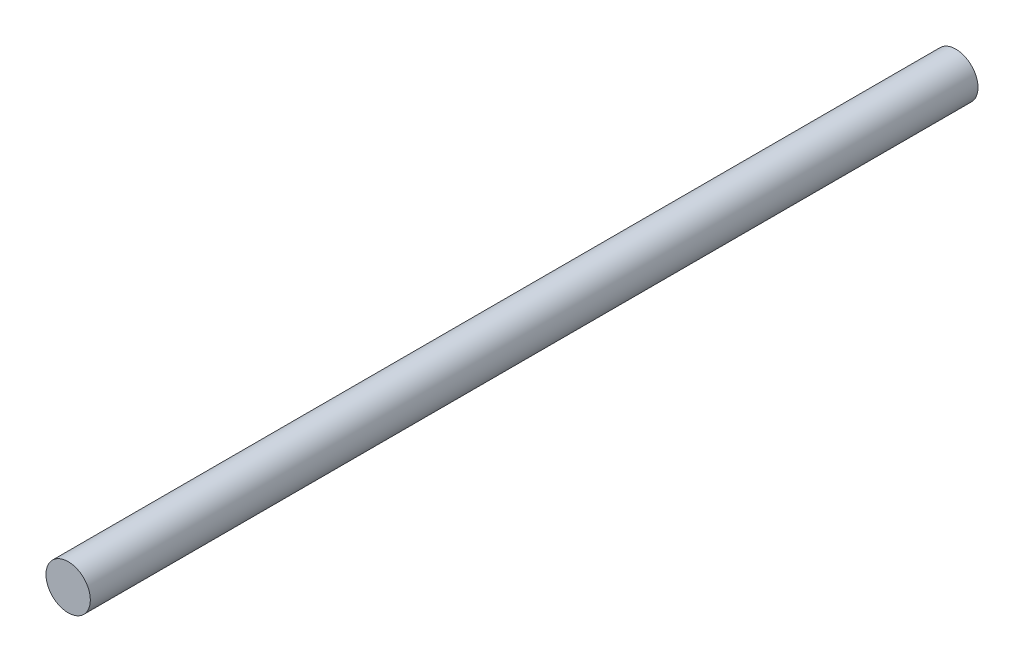
ISO-10303-21;
HEADER;
FILE_DESCRIPTION(('STEP AP214'),'2;1');
FILE_NAME('part.step','',(''),(''),'','','');
FILE_SCHEMA(('AUTOMOTIVE_DESIGN { 1 0 10303 214 1 1 1 1 }'));
ENDSEC;
DATA;
#1=APPLICATION_CONTEXT('core data for automotive mechanical design processes');
#2=APPLICATION_PROTOCOL_DEFINITION('international standard','automotive_design',2000,#1);
#3=PRODUCT_CONTEXT('',#1,'mechanical');
#4=PRODUCT('Part','Part','',(#3));
#5=PRODUCT_RELATED_PRODUCT_CATEGORY('part','',(#4));
#6=PRODUCT_DEFINITION_FORMATION('','',#4);
#7=PRODUCT_DEFINITION_CONTEXT('part definition',#1,'design');
#8=PRODUCT_DEFINITION('design','',#6,#7);
#9=PRODUCT_DEFINITION_SHAPE('','',#8);
#10=(LENGTH_UNIT() NAMED_UNIT(*) SI_UNIT(.MILLI.,.METRE.));
#11=(NAMED_UNIT(*) PLANE_ANGLE_UNIT() SI_UNIT($,.RADIAN.));
#12=(NAMED_UNIT(*) SI_UNIT($,.STERADIAN.) SOLID_ANGLE_UNIT());
#13=UNCERTAINTY_MEASURE_WITH_UNIT(LENGTH_MEASURE(1.E-05),#10,'distance_accuracy_value','');
#14=(GEOMETRIC_REPRESENTATION_CONTEXT(3) GLOBAL_UNCERTAINTY_ASSIGNED_CONTEXT((#13)) GLOBAL_UNIT_ASSIGNED_CONTEXT((#10,
#11,#12)) REPRESENTATION_CONTEXT('',''));
#15=CARTESIAN_POINT('',(0.,0.,0.));
#16=DIRECTION('',(0.,0.,1.));
#17=DIRECTION('',(1.,0.,0.));
#18=AXIS2_PLACEMENT_3D('',#15,#16,#17);
#19=CARTESIAN_POINT('',(0.,0.,47.));
#20=DIRECTION('',(0.,0.,-1.));
#21=DIRECTION('',(-1.,0.,0.));
#22=AXIS2_PLACEMENT_3D('',#19,#20,#21);
#23=CYLINDRICAL_SURFACE('',#22,2.);
#24=CARTESIAN_POINT('',(0.,0.,47.));
#25=DIRECTION('',(0.,0.,1.));
#26=DIRECTION('',(1.,0.,0.));
#27=AXIS2_PLACEMENT_3D('',#24,#25,#26);
#28=CIRCLE('',#27,2.);
#29=CARTESIAN_POINT('',(2.,0.,47.));
#30=VERTEX_POINT('',#29);
#31=EDGE_CURVE('E10',#30,#30,#28,.T.);
#32=ORIENTED_EDGE('',*,*,#31,.F.);
#33=EDGE_LOOP('',(#32));
#34=FACE_BOUND('',#33,.T.);
#35=CARTESIAN_POINT('',(0.,0.,-33.));
#36=DIRECTION('',(0.,0.,1.));
#37=DIRECTION('',(1.,0.,0.));
#38=AXIS2_PLACEMENT_3D('',#35,#36,#37);
#39=CIRCLE('',#38,2.);
#40=CARTESIAN_POINT('',(2.,0.,-33.));
#41=VERTEX_POINT('',#40);
#42=EDGE_CURVE('E39',#41,#41,#39,.T.);
#43=ORIENTED_EDGE('',*,*,#42,.T.);
#44=EDGE_LOOP('',(#43));
#45=FACE_BOUND('',#44,.T.);
#46=ADVANCED_FACE('F36',(#34,#45),#23,.T.);
#47=CARTESIAN_POINT('',(0.,0.,47.));
#48=DIRECTION('',(0.,0.,1.));
#49=DIRECTION('',(1.,0.,0.));
#50=AXIS2_PLACEMENT_3D('',#47,#48,#49);
#51=PLANE('',#50);
#52=ORIENTED_EDGE('',*,*,#31,.T.);
#53=EDGE_LOOP('',(#52));
#54=FACE_BOUND('',#53,.T.);
#55=ADVANCED_FACE('F53',(#54),#51,.T.);
#56=CARTESIAN_POINT('',(0.,0.,-33.));
#57=DIRECTION('',(0.,0.,1.));
#58=DIRECTION('',(1.,0.,0.));
#59=AXIS2_PLACEMENT_3D('',#56,#57,#58);
#60=PLANE('',#59);
#61=ORIENTED_EDGE('',*,*,#42,.F.);
#62=EDGE_LOOP('',(#61));
#63=FACE_BOUND('',#62,.T.);
#64=ADVANCED_FACE('F51',(#63),#60,.F.);
#65=CLOSED_SHELL('',(#46,#55,#64));
#66=MANIFOLD_SOLID_BREP('B2',#65);
#67=ADVANCED_BREP_SHAPE_REPRESENTATION('',(#18,#66),#14);
#68=SHAPE_DEFINITION_REPRESENTATION(#9,#67);
ENDSEC;
END-ISO-10303-21;
